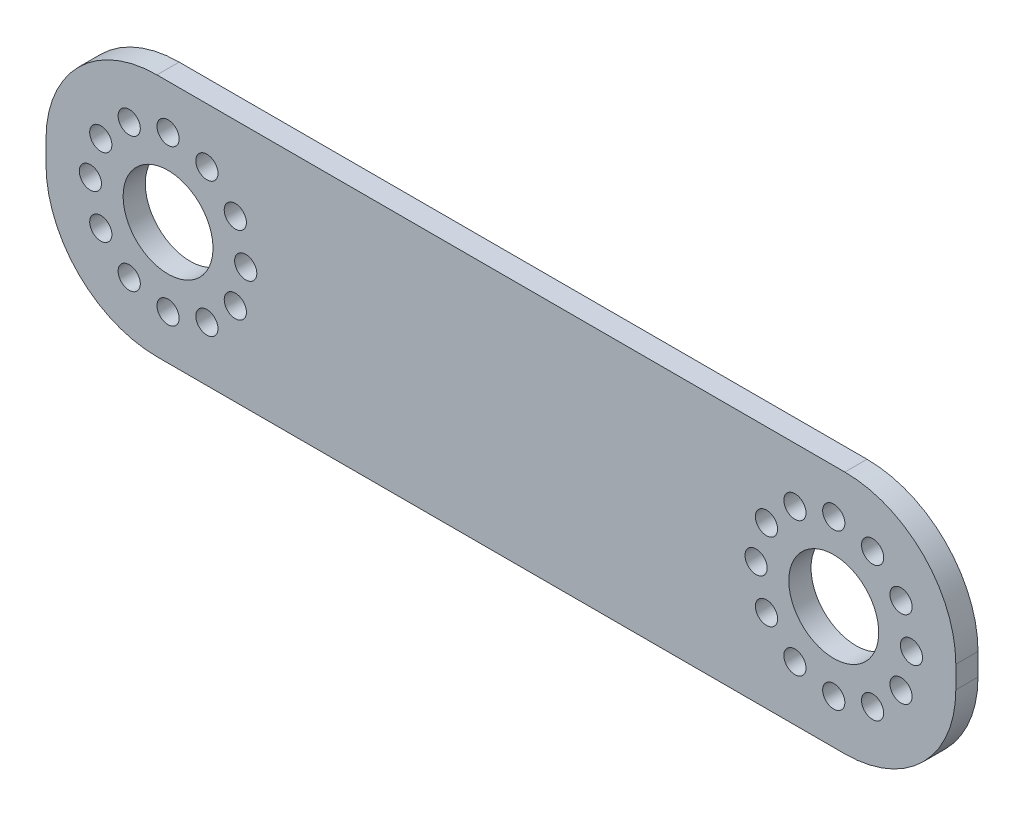
ISO-10303-21;
HEADER;
FILE_DESCRIPTION(('STEP AP214'),'2;1');
FILE_NAME('part.step','',(''),(''),'','','');
FILE_SCHEMA(('AUTOMOTIVE_DESIGN { 1 0 10303 214 1 1 1 1 }'));
ENDSEC;
DATA;
#1=APPLICATION_CONTEXT('core data for automotive mechanical design processes');
#2=APPLICATION_PROTOCOL_DEFINITION('international standard','automotive_design',2000,#1);
#3=PRODUCT_CONTEXT('',#1,'mechanical');
#4=PRODUCT('Part','Part','',(#3));
#5=PRODUCT_RELATED_PRODUCT_CATEGORY('part','',(#4));
#6=PRODUCT_DEFINITION_FORMATION('','',#4);
#7=PRODUCT_DEFINITION_CONTEXT('part definition',#1,'design');
#8=PRODUCT_DEFINITION('design','',#6,#7);
#9=PRODUCT_DEFINITION_SHAPE('','',#8);
#10=(LENGTH_UNIT() NAMED_UNIT(*) SI_UNIT(.MILLI.,.METRE.));
#11=(NAMED_UNIT(*) PLANE_ANGLE_UNIT() SI_UNIT($,.RADIAN.));
#12=(NAMED_UNIT(*) SI_UNIT($,.STERADIAN.) SOLID_ANGLE_UNIT());
#13=UNCERTAINTY_MEASURE_WITH_UNIT(LENGTH_MEASURE(1.E-05),#10,'distance_accuracy_value','');
#14=(GEOMETRIC_REPRESENTATION_CONTEXT(3) GLOBAL_UNCERTAINTY_ASSIGNED_CONTEXT((#13)) GLOBAL_UNIT_ASSIGNED_CONTEXT((#10,
#11,#12)) REPRESENTATION_CONTEXT('',''));
#15=CARTESIAN_POINT('',(0.,0.,0.));
#16=DIRECTION('',(0.,0.,1.));
#17=DIRECTION('',(1.,0.,0.));
#18=AXIS2_PLACEMENT_3D('',#15,#16,#17);
#19=CARTESIAN_POINT('',(82.,11.,2.));
#20=DIRECTION('',(1.,0.,0.));
#21=DIRECTION('',(0.,0.,-1.));
#22=AXIS2_PLACEMENT_3D('',#19,#20,#21);
#23=PLANE('',#22);
#24=DIRECTION('',(0.,-1.,0.));
#25=VECTOR('',#24,1.);
#26=CARTESIAN_POINT('',(82.,11.,0.));
#27=LINE('',#26,#25);
#28=CARTESIAN_POINT('',(82.,0.999999999999999,0.));
#29=VERTEX_POINT('',#28);
#30=CARTESIAN_POINT('',(82.,-0.999999999999999,0.));
#31=VERTEX_POINT('',#30);
#32=EDGE_CURVE('E184',#29,#31,#27,.T.);
#33=ORIENTED_EDGE('',*,*,#32,.F.);
#34=DIRECTION('',(0.,0.,-1.));
#35=VECTOR('',#34,1.);
#36=CARTESIAN_POINT('',(82.,0.999999999999999,2.));
#37=LINE('',#36,#35);
#38=CARTESIAN_POINT('',(82.,0.999999999999999,2.));
#39=VERTEX_POINT('',#38);
#40=EDGE_CURVE('E154',#29,#39,#37,.F.);
#41=ORIENTED_EDGE('',*,*,#40,.T.);
#42=DIRECTION('',(0.,-1.,0.));
#43=VECTOR('',#42,1.);
#44=CARTESIAN_POINT('',(82.,11.,2.));
#45=LINE('',#44,#43);
#46=CARTESIAN_POINT('',(82.,-0.999999999999999,2.));
#47=VERTEX_POINT('',#46);
#48=EDGE_CURVE('E128',#39,#47,#45,.T.);
#49=ORIENTED_EDGE('',*,*,#48,.T.);
#50=DIRECTION('',(0.,0.,-1.));
#51=VECTOR('',#50,1.);
#52=CARTESIAN_POINT('',(82.,-0.999999999999999,2.));
#53=LINE('',#52,#51);
#54=EDGE_CURVE('E150',#47,#31,#53,.T.);
#55=ORIENTED_EDGE('',*,*,#54,.T.);
#56=EDGE_LOOP('',(#33,#41,#49,#55));
#57=FACE_BOUND('',#56,.T.);
#58=ADVANCED_FACE('F39',(#57),#23,.T.);
#59=CARTESIAN_POINT('',(0.,11.,2.));
#60=DIRECTION('',(0.,1.,0.));
#61=DIRECTION('',(-1.,0.,0.));
#62=AXIS2_PLACEMENT_3D('',#59,#60,#61);
#63=PLANE('',#62);
#64=DIRECTION('',(1.,0.,0.));
#65=VECTOR('',#64,1.);
#66=CARTESIAN_POINT('',(0.,11.,2.));
#67=LINE('',#66,#65);
#68=CARTESIAN_POINT('',(10.,11.,2.));
#69=VERTEX_POINT('',#68);
#70=CARTESIAN_POINT('',(72.,11.,2.));
#71=VERTEX_POINT('',#70);
#72=EDGE_CURVE('E133',#69,#71,#67,.T.);
#73=ORIENTED_EDGE('',*,*,#72,.T.);
#74=DIRECTION('',(0.,0.,-1.));
#75=VECTOR('',#74,1.);
#76=CARTESIAN_POINT('',(72.,11.,2.));
#77=LINE('',#76,#75);
#78=CARTESIAN_POINT('',(72.,11.,0.));
#79=VERTEX_POINT('',#78);
#80=EDGE_CURVE('E118',#71,#79,#77,.T.);
#81=ORIENTED_EDGE('',*,*,#80,.T.);
#82=DIRECTION('',(1.,0.,0.));
#83=VECTOR('',#82,1.);
#84=CARTESIAN_POINT('',(0.,11.,0.));
#85=LINE('',#84,#83);
#86=CARTESIAN_POINT('',(10.,11.,0.));
#87=VERTEX_POINT('',#86);
#88=EDGE_CURVE('E109',#87,#79,#85,.T.);
#89=ORIENTED_EDGE('',*,*,#88,.F.);
#90=DIRECTION('',(0.,0.,-1.));
#91=VECTOR('',#90,1.);
#92=CARTESIAN_POINT('',(10.,11.,2.));
#93=LINE('',#92,#91);
#94=EDGE_CURVE('E124',#87,#69,#93,.F.);
#95=ORIENTED_EDGE('',*,*,#94,.T.);
#96=EDGE_LOOP('',(#73,#81,#89,#95));
#97=FACE_BOUND('',#96,.T.);
#98=ADVANCED_FACE('F123',(#97),#63,.T.);
#99=CARTESIAN_POINT('',(0.,-11.,2.));
#100=DIRECTION('',(-1.,0.,0.));
#101=DIRECTION('',(0.,-1.,0.));
#102=AXIS2_PLACEMENT_3D('',#99,#100,#101);
#103=PLANE('',#102);
#104=DIRECTION('',(0.,1.,0.));
#105=VECTOR('',#104,1.);
#106=CARTESIAN_POINT('',(0.,-11.,0.));
#107=LINE('',#106,#105);
#108=CARTESIAN_POINT('',(0.,-0.999999999999996,0.));
#109=VERTEX_POINT('',#108);
#110=CARTESIAN_POINT('',(0.,1.,0.));
#111=VERTEX_POINT('',#110);
#112=EDGE_CURVE('E111',#109,#111,#107,.T.);
#113=ORIENTED_EDGE('',*,*,#112,.F.);
#114=DIRECTION('',(0.,0.,-1.));
#115=VECTOR('',#114,1.);
#116=CARTESIAN_POINT('',(0.,-0.999999999999996,2.));
#117=LINE('',#116,#115);
#118=CARTESIAN_POINT('',(0.,-0.999999999999996,2.));
#119=VERTEX_POINT('',#118);
#120=EDGE_CURVE('E11',#109,#119,#117,.F.);
#121=ORIENTED_EDGE('',*,*,#120,.T.);
#122=DIRECTION('',(0.,1.,0.));
#123=VECTOR('',#122,1.);
#124=CARTESIAN_POINT('',(0.,-11.,2.));
#125=LINE('',#124,#123);
#126=CARTESIAN_POINT('',(0.,1.,2.));
#127=VERTEX_POINT('',#126);
#128=EDGE_CURVE('E138',#119,#127,#125,.T.);
#129=ORIENTED_EDGE('',*,*,#128,.T.);
#130=DIRECTION('',(0.,0.,-1.));
#131=VECTOR('',#130,1.);
#132=CARTESIAN_POINT('',(0.,1.,2.));
#133=LINE('',#132,#131);
#134=EDGE_CURVE('E48',#127,#111,#133,.T.);
#135=ORIENTED_EDGE('',*,*,#134,.T.);
#136=EDGE_LOOP('',(#113,#121,#129,#135));
#137=FACE_BOUND('',#136,.T.);
#138=ADVANCED_FACE('F175',(#137),#103,.T.);
#139=CARTESIAN_POINT('',(82.,-11.,2.));
#140=DIRECTION('',(0.,-1.,0.));
#141=DIRECTION('',(1.,0.,0.));
#142=AXIS2_PLACEMENT_3D('',#139,#140,#141);
#143=PLANE('',#142);
#144=DIRECTION('',(-1.,0.,0.));
#145=VECTOR('',#144,1.);
#146=CARTESIAN_POINT('',(82.,-11.,0.));
#147=LINE('',#146,#145);
#148=CARTESIAN_POINT('',(72.,-11.,0.));
#149=VERTEX_POINT('',#148);
#150=CARTESIAN_POINT('',(9.99999999999999,-11.,0.));
#151=VERTEX_POINT('',#150);
#152=EDGE_CURVE('E188',#149,#151,#147,.T.);
#153=ORIENTED_EDGE('',*,*,#152,.F.);
#154=DIRECTION('',(0.,0.,-1.));
#155=VECTOR('',#154,1.);
#156=CARTESIAN_POINT('',(72.,-11.,2.));
#157=LINE('',#156,#155);
#158=CARTESIAN_POINT('',(72.,-11.,2.));
#159=VERTEX_POINT('',#158);
#160=EDGE_CURVE('E62',#149,#159,#157,.F.);
#161=ORIENTED_EDGE('',*,*,#160,.T.);
#162=DIRECTION('',(-1.,0.,0.));
#163=VECTOR('',#162,1.);
#164=CARTESIAN_POINT('',(82.,-11.,2.));
#165=LINE('',#164,#163);
#166=CARTESIAN_POINT('',(9.99999999999999,-11.,2.));
#167=VERTEX_POINT('',#166);
#168=EDGE_CURVE('E178',#159,#167,#165,.T.);
#169=ORIENTED_EDGE('',*,*,#168,.T.);
#170=DIRECTION('',(0.,0.,-1.));
#171=VECTOR('',#170,1.);
#172=CARTESIAN_POINT('',(9.99999999999999,-11.,2.));
#173=LINE('',#172,#171);
#174=EDGE_CURVE('E167',#167,#151,#173,.T.);
#175=ORIENTED_EDGE('',*,*,#174,.T.);
#176=EDGE_LOOP('',(#153,#161,#169,#175));
#177=FACE_BOUND('',#176,.T.);
#178=ADVANCED_FACE('F413',(#177),#143,.T.);
#179=CARTESIAN_POINT('',(0.,0.,2.));
#180=DIRECTION('',(0.,0.,-1.));
#181=DIRECTION('',(-1.,0.,0.));
#182=AXIS2_PLACEMENT_3D('',#179,#180,#181);
#183=PLANE('',#182);
#184=CARTESIAN_POINT('',(64.9378221735089,3.5,2.));
#185=DIRECTION('',(0.,0.,-1.));
#186=DIRECTION('',(-1.,0.,0.));
#187=AXIS2_PLACEMENT_3D('',#184,#185,#186);
#188=CIRCLE('',#187,0.999999999999998);
#189=CARTESIAN_POINT('',(63.9378221735089,3.5,2.));
#190=VERTEX_POINT('',#189);
#191=EDGE_CURVE('E393',#190,#190,#188,.T.);
#192=ORIENTED_EDGE('',*,*,#191,.T.);
#193=EDGE_LOOP('',(#192));
#194=FACE_BOUND('',#193,.T.);
#195=CARTESIAN_POINT('',(67.5,6.06217782649107,2.));
#196=DIRECTION('',(0.,0.,-1.));
#197=DIRECTION('',(-1.,0.,0.));
#198=AXIS2_PLACEMENT_3D('',#195,#196,#197);
#199=CIRCLE('',#198,1.00000000000001);
#200=CARTESIAN_POINT('',(66.5,6.06217782649107,2.));
#201=VERTEX_POINT('',#200);
#202=EDGE_CURVE('E385',#201,#201,#199,.T.);
#203=ORIENTED_EDGE('',*,*,#202,.T.);
#204=EDGE_LOOP('',(#203));
#205=FACE_BOUND('',#204,.T.);
#206=CARTESIAN_POINT('',(71.,7.,2.));
#207=DIRECTION('',(0.,0.,-1.));
#208=DIRECTION('',(-1.,0.,0.));
#209=AXIS2_PLACEMENT_3D('',#206,#207,#208);
#210=CIRCLE('',#209,0.999999999999998);
#211=CARTESIAN_POINT('',(70.,7.,2.));
#212=VERTEX_POINT('',#211);
#213=EDGE_CURVE('E377',#212,#212,#210,.T.);
#214=ORIENTED_EDGE('',*,*,#213,.T.);
#215=EDGE_LOOP('',(#214));
#216=FACE_BOUND('',#215,.T.);
#217=CARTESIAN_POINT('',(74.5,6.06217782649107,2.));
#218=DIRECTION('',(0.,0.,-1.));
#219=DIRECTION('',(-1.,0.,0.));
#220=AXIS2_PLACEMENT_3D('',#217,#218,#219);
#221=CIRCLE('',#220,0.999999999999998);
#222=CARTESIAN_POINT('',(73.5,6.06217782649107,2.));
#223=VERTEX_POINT('',#222);
#224=EDGE_CURVE('E369',#223,#223,#221,.T.);
#225=ORIENTED_EDGE('',*,*,#224,.T.);
#226=EDGE_LOOP('',(#225));
#227=FACE_BOUND('',#226,.T.);
#228=CARTESIAN_POINT('',(77.0621778264911,3.5,2.));
#229=DIRECTION('',(0.,0.,-1.));
#230=DIRECTION('',(-1.,0.,0.));
#231=AXIS2_PLACEMENT_3D('',#228,#229,#230);
#232=CIRCLE('',#231,0.999999999999998);
#233=CARTESIAN_POINT('',(76.0621778264911,3.5,2.));
#234=VERTEX_POINT('',#233);
#235=EDGE_CURVE('E361',#234,#234,#232,.T.);
#236=ORIENTED_EDGE('',*,*,#235,.T.);
#237=EDGE_LOOP('',(#236));
#238=FACE_BOUND('',#237,.T.);
#239=CARTESIAN_POINT('',(78.,0.,2.));
#240=DIRECTION('',(0.,0.,-1.));
#241=DIRECTION('',(-1.,0.,0.));
#242=AXIS2_PLACEMENT_3D('',#239,#240,#241);
#243=CIRCLE('',#242,1.00000000000001);
#244=CARTESIAN_POINT('',(77.,0.,2.));
#245=VERTEX_POINT('',#244);
#246=EDGE_CURVE('E353',#245,#245,#243,.T.);
#247=ORIENTED_EDGE('',*,*,#246,.T.);
#248=EDGE_LOOP('',(#247));
#249=FACE_BOUND('',#248,.T.);
#250=CARTESIAN_POINT('',(77.0621778264911,-3.5,2.));
#251=DIRECTION('',(0.,0.,-1.));
#252=DIRECTION('',(-1.,0.,0.));
#253=AXIS2_PLACEMENT_3D('',#250,#251,#252);
#254=CIRCLE('',#253,0.999999999999998);
#255=CARTESIAN_POINT('',(76.0621778264911,-3.5,2.));
#256=VERTEX_POINT('',#255);
#257=EDGE_CURVE('E345',#256,#256,#254,.T.);
#258=ORIENTED_EDGE('',*,*,#257,.T.);
#259=EDGE_LOOP('',(#258));
#260=FACE_BOUND('',#259,.T.);
#261=CARTESIAN_POINT('',(74.5,-6.06217782649107,2.));
#262=DIRECTION('',(0.,0.,-1.));
#263=DIRECTION('',(-1.,0.,0.));
#264=AXIS2_PLACEMENT_3D('',#261,#262,#263);
#265=CIRCLE('',#264,1.00000000000001);
#266=CARTESIAN_POINT('',(73.5,-6.06217782649107,2.));
#267=VERTEX_POINT('',#266);
#268=EDGE_CURVE('E337',#267,#267,#265,.T.);
#269=ORIENTED_EDGE('',*,*,#268,.T.);
#270=EDGE_LOOP('',(#269));
#271=FACE_BOUND('',#270,.T.);
#272=CARTESIAN_POINT('',(71.,-7.,2.));
#273=DIRECTION('',(0.,0.,-1.));
#274=DIRECTION('',(-1.,0.,0.));
#275=AXIS2_PLACEMENT_3D('',#272,#273,#274);
#276=CIRCLE('',#275,0.999999999999998);
#277=CARTESIAN_POINT('',(70.,-7.,2.));
#278=VERTEX_POINT('',#277);
#279=EDGE_CURVE('E329',#278,#278,#276,.T.);
#280=ORIENTED_EDGE('',*,*,#279,.T.);
#281=EDGE_LOOP('',(#280));
#282=FACE_BOUND('',#281,.T.);
#283=CARTESIAN_POINT('',(67.5,-6.06217782649107,2.));
#284=DIRECTION('',(0.,0.,-1.));
#285=DIRECTION('',(-1.,0.,0.));
#286=AXIS2_PLACEMENT_3D('',#283,#284,#285);
#287=CIRCLE('',#286,0.999999999999998);
#288=CARTESIAN_POINT('',(66.5,-6.06217782649107,2.));
#289=VERTEX_POINT('',#288);
#290=EDGE_CURVE('E321',#289,#289,#287,.T.);
#291=ORIENTED_EDGE('',*,*,#290,.T.);
#292=EDGE_LOOP('',(#291));
#293=FACE_BOUND('',#292,.T.);
#294=CARTESIAN_POINT('',(64.9378221735089,-3.5,2.));
#295=DIRECTION('',(0.,0.,-1.));
#296=DIRECTION('',(-1.,0.,0.));
#297=AXIS2_PLACEMENT_3D('',#294,#295,#296);
#298=CIRCLE('',#297,0.999999999999998);
#299=CARTESIAN_POINT('',(63.9378221735089,-3.5,2.));
#300=VERTEX_POINT('',#299);
#301=EDGE_CURVE('E313',#300,#300,#298,.T.);
#302=ORIENTED_EDGE('',*,*,#301,.T.);
#303=EDGE_LOOP('',(#302));
#304=FACE_BOUND('',#303,.T.);
#305=CARTESIAN_POINT('',(64.,0.,2.));
#306=DIRECTION('',(0.,0.,-1.));
#307=DIRECTION('',(-1.,0.,0.));
#308=AXIS2_PLACEMENT_3D('',#305,#306,#307);
#309=CIRCLE('',#308,0.999999999999998);
#310=CARTESIAN_POINT('',(63.,0.,2.));
#311=VERTEX_POINT('',#310);
#312=EDGE_CURVE('E305',#311,#311,#309,.T.);
#313=ORIENTED_EDGE('',*,*,#312,.T.);
#314=EDGE_LOOP('',(#313));
#315=FACE_BOUND('',#314,.T.);
#316=CARTESIAN_POINT('',(71.,0.,2.));
#317=DIRECTION('',(0.,0.,-1.));
#318=DIRECTION('',(-1.,0.,0.));
#319=AXIS2_PLACEMENT_3D('',#316,#317,#318);
#320=CIRCLE('',#319,4.05);
#321=CARTESIAN_POINT('',(66.95,0.,2.));
#322=VERTEX_POINT('',#321);
#323=EDGE_CURVE('E297',#322,#322,#320,.T.);
#324=ORIENTED_EDGE('',*,*,#323,.T.);
#325=EDGE_LOOP('',(#324));
#326=FACE_BOUND('',#325,.T.);
#327=CARTESIAN_POINT('',(4.93782217350893,3.5,2.));
#328=DIRECTION('',(0.,0.,-1.));
#329=DIRECTION('',(-1.,0.,0.));
#330=AXIS2_PLACEMENT_3D('',#327,#328,#329);
#331=CIRCLE('',#330,1.);
#332=CARTESIAN_POINT('',(3.93782217350893,3.5,2.));
#333=VERTEX_POINT('',#332);
#334=EDGE_CURVE('E289',#333,#333,#331,.T.);
#335=ORIENTED_EDGE('',*,*,#334,.T.);
#336=EDGE_LOOP('',(#335));
#337=FACE_BOUND('',#336,.T.);
#338=CARTESIAN_POINT('',(7.5,6.06217782649107,2.));
#339=DIRECTION('',(0.,0.,-1.));
#340=DIRECTION('',(-1.,0.,0.));
#341=AXIS2_PLACEMENT_3D('',#338,#339,#340);
#342=CIRCLE('',#341,1.);
#343=CARTESIAN_POINT('',(6.5,6.06217782649107,2.));
#344=VERTEX_POINT('',#343);
#345=EDGE_CURVE('E281',#344,#344,#342,.T.);
#346=ORIENTED_EDGE('',*,*,#345,.T.);
#347=EDGE_LOOP('',(#346));
#348=FACE_BOUND('',#347,.T.);
#349=CARTESIAN_POINT('',(11.,7.,2.));
#350=DIRECTION('',(0.,0.,-1.));
#351=DIRECTION('',(-1.,0.,0.));
#352=AXIS2_PLACEMENT_3D('',#349,#350,#351);
#353=CIRCLE('',#352,1.);
#354=CARTESIAN_POINT('',(10.,7.,2.));
#355=VERTEX_POINT('',#354);
#356=EDGE_CURVE('E273',#355,#355,#353,.T.);
#357=ORIENTED_EDGE('',*,*,#356,.T.);
#358=EDGE_LOOP('',(#357));
#359=FACE_BOUND('',#358,.T.);
#360=CARTESIAN_POINT('',(14.5,6.06217782649107,2.));
#361=DIRECTION('',(0.,0.,-1.));
#362=DIRECTION('',(-1.,0.,0.));
#363=AXIS2_PLACEMENT_3D('',#360,#361,#362);
#364=CIRCLE('',#363,1.);
#365=CARTESIAN_POINT('',(13.5,6.06217782649107,2.));
#366=VERTEX_POINT('',#365);
#367=EDGE_CURVE('E265',#366,#366,#364,.T.);
#368=ORIENTED_EDGE('',*,*,#367,.T.);
#369=EDGE_LOOP('',(#368));
#370=FACE_BOUND('',#369,.T.);
#371=CARTESIAN_POINT('',(17.0621778264911,3.5,2.));
#372=DIRECTION('',(0.,0.,-1.));
#373=DIRECTION('',(-1.,0.,0.));
#374=AXIS2_PLACEMENT_3D('',#371,#372,#373);
#375=CIRCLE('',#374,1.);
#376=CARTESIAN_POINT('',(16.0621778264911,3.5,2.));
#377=VERTEX_POINT('',#376);
#378=EDGE_CURVE('E257',#377,#377,#375,.T.);
#379=ORIENTED_EDGE('',*,*,#378,.T.);
#380=EDGE_LOOP('',(#379));
#381=FACE_BOUND('',#380,.T.);
#382=CARTESIAN_POINT('',(18.,0.,2.));
#383=DIRECTION('',(0.,0.,-1.));
#384=DIRECTION('',(-1.,0.,0.));
#385=AXIS2_PLACEMENT_3D('',#382,#383,#384);
#386=CIRCLE('',#385,0.999999999999998);
#387=CARTESIAN_POINT('',(17.,0.,2.));
#388=VERTEX_POINT('',#387);
#389=EDGE_CURVE('E249',#388,#388,#386,.T.);
#390=ORIENTED_EDGE('',*,*,#389,.T.);
#391=EDGE_LOOP('',(#390));
#392=FACE_BOUND('',#391,.T.);
#393=CARTESIAN_POINT('',(17.0621778264911,-3.5,2.));
#394=DIRECTION('',(0.,0.,-1.));
#395=DIRECTION('',(-1.,0.,0.));
#396=AXIS2_PLACEMENT_3D('',#393,#394,#395);
#397=CIRCLE('',#396,0.999999999999998);
#398=CARTESIAN_POINT('',(16.0621778264911,-3.5,2.));
#399=VERTEX_POINT('',#398);
#400=EDGE_CURVE('E241',#399,#399,#397,.T.);
#401=ORIENTED_EDGE('',*,*,#400,.T.);
#402=EDGE_LOOP('',(#401));
#403=FACE_BOUND('',#402,.T.);
#404=CARTESIAN_POINT('',(14.5,-6.06217782649107,2.));
#405=DIRECTION('',(0.,0.,-1.));
#406=DIRECTION('',(-1.,0.,0.));
#407=AXIS2_PLACEMENT_3D('',#404,#405,#406);
#408=CIRCLE('',#407,1.);
#409=CARTESIAN_POINT('',(13.5,-6.06217782649107,2.));
#410=VERTEX_POINT('',#409);
#411=EDGE_CURVE('E233',#410,#410,#408,.T.);
#412=ORIENTED_EDGE('',*,*,#411,.T.);
#413=EDGE_LOOP('',(#412));
#414=FACE_BOUND('',#413,.T.);
#415=CARTESIAN_POINT('',(11.,-7.,2.));
#416=DIRECTION('',(0.,0.,-1.));
#417=DIRECTION('',(-1.,0.,0.));
#418=AXIS2_PLACEMENT_3D('',#415,#416,#417);
#419=CIRCLE('',#418,1.);
#420=CARTESIAN_POINT('',(10.,-7.,2.));
#421=VERTEX_POINT('',#420);
#422=EDGE_CURVE('E225',#421,#421,#419,.T.);
#423=ORIENTED_EDGE('',*,*,#422,.T.);
#424=EDGE_LOOP('',(#423));
#425=FACE_BOUND('',#424,.T.);
#426=CARTESIAN_POINT('',(7.5,-6.06217782649107,2.));
#427=DIRECTION('',(0.,0.,-1.));
#428=DIRECTION('',(-1.,0.,0.));
#429=AXIS2_PLACEMENT_3D('',#426,#427,#428);
#430=CIRCLE('',#429,1.);
#431=CARTESIAN_POINT('',(6.5,-6.06217782649107,2.));
#432=VERTEX_POINT('',#431);
#433=EDGE_CURVE('E217',#432,#432,#430,.T.);
#434=ORIENTED_EDGE('',*,*,#433,.T.);
#435=EDGE_LOOP('',(#434));
#436=FACE_BOUND('',#435,.T.);
#437=CARTESIAN_POINT('',(4.93782217350893,-3.5,2.));
#438=DIRECTION('',(0.,0.,-1.));
#439=DIRECTION('',(-1.,0.,0.));
#440=AXIS2_PLACEMENT_3D('',#437,#438,#439);
#441=CIRCLE('',#440,1.);
#442=CARTESIAN_POINT('',(3.93782217350893,-3.5,2.));
#443=VERTEX_POINT('',#442);
#444=EDGE_CURVE('E209',#443,#443,#441,.T.);
#445=ORIENTED_EDGE('',*,*,#444,.T.);
#446=EDGE_LOOP('',(#445));
#447=FACE_BOUND('',#446,.T.);
#448=CARTESIAN_POINT('',(4.,0.,2.));
#449=DIRECTION('',(0.,0.,-1.));
#450=DIRECTION('',(-1.,0.,0.));
#451=AXIS2_PLACEMENT_3D('',#448,#449,#450);
#452=CIRCLE('',#451,1.);
#453=CARTESIAN_POINT('',(3.,0.,2.));
#454=VERTEX_POINT('',#453);
#455=EDGE_CURVE('E201',#454,#454,#452,.T.);
#456=ORIENTED_EDGE('',*,*,#455,.T.);
#457=EDGE_LOOP('',(#456));
#458=FACE_BOUND('',#457,.T.);
#459=CARTESIAN_POINT('',(11.,0.,2.));
#460=DIRECTION('',(0.,0.,-1.));
#461=DIRECTION('',(-1.,0.,0.));
#462=AXIS2_PLACEMENT_3D('',#459,#460,#461);
#463=CIRCLE('',#462,4.05);
#464=CARTESIAN_POINT('',(6.95,0.,2.));
#465=VERTEX_POINT('',#464);
#466=EDGE_CURVE('E189',#465,#465,#463,.T.);
#467=ORIENTED_EDGE('',*,*,#466,.T.);
#468=EDGE_LOOP('',(#467));
#469=FACE_BOUND('',#468,.T.);
#470=ORIENTED_EDGE('',*,*,#48,.F.);
#471=CARTESIAN_POINT('',(72.,0.999999999999999,2.));
#472=DIRECTION('',(0.,0.,-1.));
#473=DIRECTION('',(-1.,0.,0.));
#474=AXIS2_PLACEMENT_3D('',#471,#472,#473);
#475=CIRCLE('',#474,10.);
#476=EDGE_CURVE('E164',#39,#71,#475,.F.);
#477=ORIENTED_EDGE('',*,*,#476,.T.);
#478=ORIENTED_EDGE('',*,*,#72,.F.);
#479=CARTESIAN_POINT('',(10.,1.,2.));
#480=DIRECTION('',(0.,0.,-1.));
#481=DIRECTION('',(-1.,0.,0.));
#482=AXIS2_PLACEMENT_3D('',#479,#480,#481);
#483=CIRCLE('',#482,10.);
#484=EDGE_CURVE('E131',#69,#127,#483,.F.);
#485=ORIENTED_EDGE('',*,*,#484,.T.);
#486=ORIENTED_EDGE('',*,*,#128,.F.);
#487=CARTESIAN_POINT('',(9.99999999999999,-0.999999999999998,2.));
#488=DIRECTION('',(0.,0.,-1.));
#489=DIRECTION('',(-1.,0.,0.));
#490=AXIS2_PLACEMENT_3D('',#487,#488,#489);
#491=CIRCLE('',#490,10.);
#492=EDGE_CURVE('E55',#119,#167,#491,.F.);
#493=ORIENTED_EDGE('',*,*,#492,.T.);
#494=ORIENTED_EDGE('',*,*,#168,.F.);
#495=CARTESIAN_POINT('',(72.,-0.999999999999999,2.));
#496=DIRECTION('',(0.,0.,-1.));
#497=DIRECTION('',(-1.,0.,0.));
#498=AXIS2_PLACEMENT_3D('',#495,#496,#497);
#499=CIRCLE('',#498,10.);
#500=EDGE_CURVE('E161',#159,#47,#499,.F.);
#501=ORIENTED_EDGE('',*,*,#500,.T.);
#502=EDGE_LOOP('',(#470,#477,#478,#485,#486,#493,#494,#501));
#503=FACE_BOUND('',#502,.T.);
#504=ADVANCED_FACE('F442',(#194,#205,#216,#227,#238,#249,#260,#271,#282,#293,#304,#315,#326,
#337,#348,#359,#370,#381,#392,#403,#414,#425,#436,#447,#458,#469,#503),#183,.F.);
#505=CARTESIAN_POINT('',(0.,0.,0.));
#506=DIRECTION('',(0.,0.,-1.));
#507=DIRECTION('',(-1.,0.,0.));
#508=AXIS2_PLACEMENT_3D('',#505,#506,#507);
#509=PLANE('',#508);
#510=CARTESIAN_POINT('',(64.9378221735089,3.5,0.));
#511=DIRECTION('',(0.,0.,-1.));
#512=DIRECTION('',(-1.,0.,0.));
#513=AXIS2_PLACEMENT_3D('',#510,#511,#512);
#514=CIRCLE('',#513,0.999999999999998);
#515=CARTESIAN_POINT('',(63.9378221735089,3.5,0.));
#516=VERTEX_POINT('',#515);
#517=EDGE_CURVE('E397',#516,#516,#514,.T.);
#518=ORIENTED_EDGE('',*,*,#517,.F.);
#519=EDGE_LOOP('',(#518));
#520=FACE_BOUND('',#519,.T.);
#521=CARTESIAN_POINT('',(67.5,6.06217782649107,0.));
#522=DIRECTION('',(0.,0.,-1.));
#523=DIRECTION('',(-1.,0.,0.));
#524=AXIS2_PLACEMENT_3D('',#521,#522,#523);
#525=CIRCLE('',#524,1.00000000000001);
#526=CARTESIAN_POINT('',(66.5,6.06217782649107,0.));
#527=VERTEX_POINT('',#526);
#528=EDGE_CURVE('E389',#527,#527,#525,.T.);
#529=ORIENTED_EDGE('',*,*,#528,.F.);
#530=EDGE_LOOP('',(#529));
#531=FACE_BOUND('',#530,.T.);
#532=CARTESIAN_POINT('',(71.,7.,0.));
#533=DIRECTION('',(0.,0.,-1.));
#534=DIRECTION('',(-1.,0.,0.));
#535=AXIS2_PLACEMENT_3D('',#532,#533,#534);
#536=CIRCLE('',#535,0.999999999999998);
#537=CARTESIAN_POINT('',(70.,7.,0.));
#538=VERTEX_POINT('',#537);
#539=EDGE_CURVE('E381',#538,#538,#536,.T.);
#540=ORIENTED_EDGE('',*,*,#539,.F.);
#541=EDGE_LOOP('',(#540));
#542=FACE_BOUND('',#541,.T.);
#543=CARTESIAN_POINT('',(74.5,6.06217782649107,0.));
#544=DIRECTION('',(0.,0.,-1.));
#545=DIRECTION('',(-1.,0.,0.));
#546=AXIS2_PLACEMENT_3D('',#543,#544,#545);
#547=CIRCLE('',#546,0.999999999999998);
#548=CARTESIAN_POINT('',(73.5,6.06217782649107,0.));
#549=VERTEX_POINT('',#548);
#550=EDGE_CURVE('E373',#549,#549,#547,.T.);
#551=ORIENTED_EDGE('',*,*,#550,.F.);
#552=EDGE_LOOP('',(#551));
#553=FACE_BOUND('',#552,.T.);
#554=CARTESIAN_POINT('',(77.0621778264911,3.5,0.));
#555=DIRECTION('',(0.,0.,-1.));
#556=DIRECTION('',(-1.,0.,0.));
#557=AXIS2_PLACEMENT_3D('',#554,#555,#556);
#558=CIRCLE('',#557,0.999999999999998);
#559=CARTESIAN_POINT('',(76.0621778264911,3.5,0.));
#560=VERTEX_POINT('',#559);
#561=EDGE_CURVE('E365',#560,#560,#558,.T.);
#562=ORIENTED_EDGE('',*,*,#561,.F.);
#563=EDGE_LOOP('',(#562));
#564=FACE_BOUND('',#563,.T.);
#565=CARTESIAN_POINT('',(78.,0.,0.));
#566=DIRECTION('',(0.,0.,-1.));
#567=DIRECTION('',(-1.,0.,0.));
#568=AXIS2_PLACEMENT_3D('',#565,#566,#567);
#569=CIRCLE('',#568,1.00000000000001);
#570=CARTESIAN_POINT('',(77.,0.,0.));
#571=VERTEX_POINT('',#570);
#572=EDGE_CURVE('E357',#571,#571,#569,.T.);
#573=ORIENTED_EDGE('',*,*,#572,.F.);
#574=EDGE_LOOP('',(#573));
#575=FACE_BOUND('',#574,.T.);
#576=CARTESIAN_POINT('',(77.0621778264911,-3.5,0.));
#577=DIRECTION('',(0.,0.,-1.));
#578=DIRECTION('',(-1.,0.,0.));
#579=AXIS2_PLACEMENT_3D('',#576,#577,#578);
#580=CIRCLE('',#579,0.999999999999998);
#581=CARTESIAN_POINT('',(76.0621778264911,-3.5,0.));
#582=VERTEX_POINT('',#581);
#583=EDGE_CURVE('E349',#582,#582,#580,.T.);
#584=ORIENTED_EDGE('',*,*,#583,.F.);
#585=EDGE_LOOP('',(#584));
#586=FACE_BOUND('',#585,.T.);
#587=CARTESIAN_POINT('',(74.5,-6.06217782649107,0.));
#588=DIRECTION('',(0.,0.,-1.));
#589=DIRECTION('',(-1.,0.,0.));
#590=AXIS2_PLACEMENT_3D('',#587,#588,#589);
#591=CIRCLE('',#590,1.00000000000001);
#592=CARTESIAN_POINT('',(73.5,-6.06217782649107,0.));
#593=VERTEX_POINT('',#592);
#594=EDGE_CURVE('E341',#593,#593,#591,.T.);
#595=ORIENTED_EDGE('',*,*,#594,.F.);
#596=EDGE_LOOP('',(#595));
#597=FACE_BOUND('',#596,.T.);
#598=CARTESIAN_POINT('',(71.,-7.,0.));
#599=DIRECTION('',(0.,0.,-1.));
#600=DIRECTION('',(-1.,0.,0.));
#601=AXIS2_PLACEMENT_3D('',#598,#599,#600);
#602=CIRCLE('',#601,0.999999999999998);
#603=CARTESIAN_POINT('',(70.,-7.,0.));
#604=VERTEX_POINT('',#603);
#605=EDGE_CURVE('E333',#604,#604,#602,.T.);
#606=ORIENTED_EDGE('',*,*,#605,.F.);
#607=EDGE_LOOP('',(#606));
#608=FACE_BOUND('',#607,.T.);
#609=CARTESIAN_POINT('',(67.5,-6.06217782649107,0.));
#610=DIRECTION('',(0.,0.,-1.));
#611=DIRECTION('',(-1.,0.,0.));
#612=AXIS2_PLACEMENT_3D('',#609,#610,#611);
#613=CIRCLE('',#612,0.999999999999998);
#614=CARTESIAN_POINT('',(66.5,-6.06217782649107,0.));
#615=VERTEX_POINT('',#614);
#616=EDGE_CURVE('E325',#615,#615,#613,.T.);
#617=ORIENTED_EDGE('',*,*,#616,.F.);
#618=EDGE_LOOP('',(#617));
#619=FACE_BOUND('',#618,.T.);
#620=CARTESIAN_POINT('',(64.9378221735089,-3.5,0.));
#621=DIRECTION('',(0.,0.,-1.));
#622=DIRECTION('',(-1.,0.,0.));
#623=AXIS2_PLACEMENT_3D('',#620,#621,#622);
#624=CIRCLE('',#623,0.999999999999998);
#625=CARTESIAN_POINT('',(63.9378221735089,-3.5,0.));
#626=VERTEX_POINT('',#625);
#627=EDGE_CURVE('E317',#626,#626,#624,.T.);
#628=ORIENTED_EDGE('',*,*,#627,.F.);
#629=EDGE_LOOP('',(#628));
#630=FACE_BOUND('',#629,.T.);
#631=CARTESIAN_POINT('',(64.,0.,0.));
#632=DIRECTION('',(0.,0.,-1.));
#633=DIRECTION('',(-1.,0.,0.));
#634=AXIS2_PLACEMENT_3D('',#631,#632,#633);
#635=CIRCLE('',#634,0.999999999999998);
#636=CARTESIAN_POINT('',(63.,0.,0.));
#637=VERTEX_POINT('',#636);
#638=EDGE_CURVE('E309',#637,#637,#635,.T.);
#639=ORIENTED_EDGE('',*,*,#638,.F.);
#640=EDGE_LOOP('',(#639));
#641=FACE_BOUND('',#640,.T.);
#642=CARTESIAN_POINT('',(71.,0.,0.));
#643=DIRECTION('',(0.,0.,-1.));
#644=DIRECTION('',(-1.,0.,0.));
#645=AXIS2_PLACEMENT_3D('',#642,#643,#644);
#646=CIRCLE('',#645,4.05);
#647=CARTESIAN_POINT('',(66.95,0.,0.));
#648=VERTEX_POINT('',#647);
#649=EDGE_CURVE('E301',#648,#648,#646,.T.);
#650=ORIENTED_EDGE('',*,*,#649,.F.);
#651=EDGE_LOOP('',(#650));
#652=FACE_BOUND('',#651,.T.);
#653=CARTESIAN_POINT('',(4.93782217350893,3.5,0.));
#654=DIRECTION('',(0.,0.,-1.));
#655=DIRECTION('',(-1.,0.,0.));
#656=AXIS2_PLACEMENT_3D('',#653,#654,#655);
#657=CIRCLE('',#656,1.);
#658=CARTESIAN_POINT('',(3.93782217350893,3.5,0.));
#659=VERTEX_POINT('',#658);
#660=EDGE_CURVE('E293',#659,#659,#657,.T.);
#661=ORIENTED_EDGE('',*,*,#660,.F.);
#662=EDGE_LOOP('',(#661));
#663=FACE_BOUND('',#662,.T.);
#664=CARTESIAN_POINT('',(7.5,6.06217782649107,0.));
#665=DIRECTION('',(0.,0.,-1.));
#666=DIRECTION('',(-1.,0.,0.));
#667=AXIS2_PLACEMENT_3D('',#664,#665,#666);
#668=CIRCLE('',#667,1.);
#669=CARTESIAN_POINT('',(6.5,6.06217782649107,0.));
#670=VERTEX_POINT('',#669);
#671=EDGE_CURVE('E285',#670,#670,#668,.T.);
#672=ORIENTED_EDGE('',*,*,#671,.F.);
#673=EDGE_LOOP('',(#672));
#674=FACE_BOUND('',#673,.T.);
#675=CARTESIAN_POINT('',(11.,7.,0.));
#676=DIRECTION('',(0.,0.,-1.));
#677=DIRECTION('',(-1.,0.,0.));
#678=AXIS2_PLACEMENT_3D('',#675,#676,#677);
#679=CIRCLE('',#678,1.);
#680=CARTESIAN_POINT('',(10.,7.,0.));
#681=VERTEX_POINT('',#680);
#682=EDGE_CURVE('E277',#681,#681,#679,.T.);
#683=ORIENTED_EDGE('',*,*,#682,.F.);
#684=EDGE_LOOP('',(#683));
#685=FACE_BOUND('',#684,.T.);
#686=CARTESIAN_POINT('',(14.5,6.06217782649107,0.));
#687=DIRECTION('',(0.,0.,-1.));
#688=DIRECTION('',(-1.,0.,0.));
#689=AXIS2_PLACEMENT_3D('',#686,#687,#688);
#690=CIRCLE('',#689,1.);
#691=CARTESIAN_POINT('',(13.5,6.06217782649107,0.));
#692=VERTEX_POINT('',#691);
#693=EDGE_CURVE('E269',#692,#692,#690,.T.);
#694=ORIENTED_EDGE('',*,*,#693,.F.);
#695=EDGE_LOOP('',(#694));
#696=FACE_BOUND('',#695,.T.);
#697=CARTESIAN_POINT('',(17.0621778264911,3.5,0.));
#698=DIRECTION('',(0.,0.,-1.));
#699=DIRECTION('',(-1.,0.,0.));
#700=AXIS2_PLACEMENT_3D('',#697,#698,#699);
#701=CIRCLE('',#700,1.);
#702=CARTESIAN_POINT('',(16.0621778264911,3.5,0.));
#703=VERTEX_POINT('',#702);
#704=EDGE_CURVE('E261',#703,#703,#701,.T.);
#705=ORIENTED_EDGE('',*,*,#704,.F.);
#706=EDGE_LOOP('',(#705));
#707=FACE_BOUND('',#706,.T.);
#708=CARTESIAN_POINT('',(18.,0.,0.));
#709=DIRECTION('',(0.,0.,-1.));
#710=DIRECTION('',(-1.,0.,0.));
#711=AXIS2_PLACEMENT_3D('',#708,#709,#710);
#712=CIRCLE('',#711,0.999999999999998);
#713=CARTESIAN_POINT('',(17.,0.,0.));
#714=VERTEX_POINT('',#713);
#715=EDGE_CURVE('E253',#714,#714,#712,.T.);
#716=ORIENTED_EDGE('',*,*,#715,.F.);
#717=EDGE_LOOP('',(#716));
#718=FACE_BOUND('',#717,.T.);
#719=CARTESIAN_POINT('',(17.0621778264911,-3.5,0.));
#720=DIRECTION('',(0.,0.,-1.));
#721=DIRECTION('',(-1.,0.,0.));
#722=AXIS2_PLACEMENT_3D('',#719,#720,#721);
#723=CIRCLE('',#722,0.999999999999998);
#724=CARTESIAN_POINT('',(16.0621778264911,-3.5,0.));
#725=VERTEX_POINT('',#724);
#726=EDGE_CURVE('E245',#725,#725,#723,.T.);
#727=ORIENTED_EDGE('',*,*,#726,.F.);
#728=EDGE_LOOP('',(#727));
#729=FACE_BOUND('',#728,.T.);
#730=CARTESIAN_POINT('',(14.5,-6.06217782649107,0.));
#731=DIRECTION('',(0.,0.,-1.));
#732=DIRECTION('',(-1.,0.,0.));
#733=AXIS2_PLACEMENT_3D('',#730,#731,#732);
#734=CIRCLE('',#733,1.);
#735=CARTESIAN_POINT('',(13.5,-6.06217782649107,0.));
#736=VERTEX_POINT('',#735);
#737=EDGE_CURVE('E237',#736,#736,#734,.T.);
#738=ORIENTED_EDGE('',*,*,#737,.F.);
#739=EDGE_LOOP('',(#738));
#740=FACE_BOUND('',#739,.T.);
#741=CARTESIAN_POINT('',(11.,-7.,0.));
#742=DIRECTION('',(0.,0.,-1.));
#743=DIRECTION('',(-1.,0.,0.));
#744=AXIS2_PLACEMENT_3D('',#741,#742,#743);
#745=CIRCLE('',#744,1.);
#746=CARTESIAN_POINT('',(10.,-7.,0.));
#747=VERTEX_POINT('',#746);
#748=EDGE_CURVE('E229',#747,#747,#745,.T.);
#749=ORIENTED_EDGE('',*,*,#748,.F.);
#750=EDGE_LOOP('',(#749));
#751=FACE_BOUND('',#750,.T.);
#752=CARTESIAN_POINT('',(7.5,-6.06217782649107,0.));
#753=DIRECTION('',(0.,0.,-1.));
#754=DIRECTION('',(-1.,0.,0.));
#755=AXIS2_PLACEMENT_3D('',#752,#753,#754);
#756=CIRCLE('',#755,1.);
#757=CARTESIAN_POINT('',(6.5,-6.06217782649107,0.));
#758=VERTEX_POINT('',#757);
#759=EDGE_CURVE('E221',#758,#758,#756,.T.);
#760=ORIENTED_EDGE('',*,*,#759,.F.);
#761=EDGE_LOOP('',(#760));
#762=FACE_BOUND('',#761,.T.);
#763=CARTESIAN_POINT('',(4.93782217350893,-3.5,0.));
#764=DIRECTION('',(0.,0.,-1.));
#765=DIRECTION('',(-1.,0.,0.));
#766=AXIS2_PLACEMENT_3D('',#763,#764,#765);
#767=CIRCLE('',#766,1.);
#768=CARTESIAN_POINT('',(3.93782217350893,-3.5,0.));
#769=VERTEX_POINT('',#768);
#770=EDGE_CURVE('E213',#769,#769,#767,.T.);
#771=ORIENTED_EDGE('',*,*,#770,.F.);
#772=EDGE_LOOP('',(#771));
#773=FACE_BOUND('',#772,.T.);
#774=CARTESIAN_POINT('',(4.,0.,0.));
#775=DIRECTION('',(0.,0.,-1.));
#776=DIRECTION('',(-1.,0.,0.));
#777=AXIS2_PLACEMENT_3D('',#774,#775,#776);
#778=CIRCLE('',#777,1.);
#779=CARTESIAN_POINT('',(3.,0.,0.));
#780=VERTEX_POINT('',#779);
#781=EDGE_CURVE('E205',#780,#780,#778,.T.);
#782=ORIENTED_EDGE('',*,*,#781,.F.);
#783=EDGE_LOOP('',(#782));
#784=FACE_BOUND('',#783,.T.);
#785=CARTESIAN_POINT('',(11.,0.,0.));
#786=DIRECTION('',(0.,0.,-1.));
#787=DIRECTION('',(-1.,0.,0.));
#788=AXIS2_PLACEMENT_3D('',#785,#786,#787);
#789=CIRCLE('',#788,4.05);
#790=CARTESIAN_POINT('',(6.95,0.,0.));
#791=VERTEX_POINT('',#790);
#792=EDGE_CURVE('E197',#791,#791,#789,.T.);
#793=ORIENTED_EDGE('',*,*,#792,.F.);
#794=EDGE_LOOP('',(#793));
#795=FACE_BOUND('',#794,.T.);
#796=ORIENTED_EDGE('',*,*,#88,.T.);
#797=CARTESIAN_POINT('',(72.,0.999999999999999,0.));
#798=DIRECTION('',(0.,0.,-1.));
#799=DIRECTION('',(-1.,0.,0.));
#800=AXIS2_PLACEMENT_3D('',#797,#798,#799);
#801=CIRCLE('',#800,10.);
#802=EDGE_CURVE('E147',#79,#29,#801,.T.);
#803=ORIENTED_EDGE('',*,*,#802,.T.);
#804=ORIENTED_EDGE('',*,*,#32,.T.);
#805=CARTESIAN_POINT('',(72.,-0.999999999999999,0.));
#806=DIRECTION('',(0.,0.,-1.));
#807=DIRECTION('',(-1.,0.,0.));
#808=AXIS2_PLACEMENT_3D('',#805,#806,#807);
#809=CIRCLE('',#808,10.);
#810=EDGE_CURVE('E144',#31,#149,#809,.T.);
#811=ORIENTED_EDGE('',*,*,#810,.T.);
#812=ORIENTED_EDGE('',*,*,#152,.T.);
#813=CARTESIAN_POINT('',(9.99999999999999,-0.999999999999998,0.));
#814=DIRECTION('',(0.,0.,-1.));
#815=DIRECTION('',(-1.,0.,0.));
#816=AXIS2_PLACEMENT_3D('',#813,#814,#815);
#817=CIRCLE('',#816,10.);
#818=EDGE_CURVE('E117',#151,#109,#817,.T.);
#819=ORIENTED_EDGE('',*,*,#818,.T.);
#820=ORIENTED_EDGE('',*,*,#112,.T.);
#821=CARTESIAN_POINT('',(10.,1.,0.));
#822=DIRECTION('',(0.,0.,-1.));
#823=DIRECTION('',(-1.,0.,0.));
#824=AXIS2_PLACEMENT_3D('',#821,#822,#823);
#825=CIRCLE('',#824,10.);
#826=EDGE_CURVE('E106',#111,#87,#825,.T.);
#827=ORIENTED_EDGE('',*,*,#826,.T.);
#828=EDGE_LOOP('',(#796,#803,#804,#811,#812,#819,#820,#827));
#829=FACE_BOUND('',#828,.T.);
#830=ADVANCED_FACE('F108',(#520,#531,#542,#553,#564,#575,#586,#597,#608,#619,#630,#641,#652,
#663,#674,#685,#696,#707,#718,#729,#740,#751,#762,#773,#784,#795,#829),#509,.T.);
#831=CARTESIAN_POINT('',(11.,0.,2.));
#832=DIRECTION('',(0.,0.,-1.));
#833=DIRECTION('',(-1.,0.,0.));
#834=AXIS2_PLACEMENT_3D('',#831,#832,#833);
#835=CYLINDRICAL_SURFACE('',#834,4.05);
#836=ORIENTED_EDGE('',*,*,#466,.F.);
#837=EDGE_LOOP('',(#836));
#838=FACE_BOUND('',#837,.T.);
#839=ORIENTED_EDGE('',*,*,#792,.T.);
#840=EDGE_LOOP('',(#839));
#841=FACE_BOUND('',#840,.T.);
#842=ADVANCED_FACE('F450',(#838,#841),#835,.F.);
#843=CARTESIAN_POINT('',(4.,0.,2.));
#844=DIRECTION('',(0.,0.,-1.));
#845=DIRECTION('',(-1.,0.,0.));
#846=AXIS2_PLACEMENT_3D('',#843,#844,#845);
#847=CYLINDRICAL_SURFACE('',#846,1.);
#848=ORIENTED_EDGE('',*,*,#455,.F.);
#849=EDGE_LOOP('',(#848));
#850=FACE_BOUND('',#849,.T.);
#851=ORIENTED_EDGE('',*,*,#781,.T.);
#852=EDGE_LOOP('',(#851));
#853=FACE_BOUND('',#852,.T.);
#854=ADVANCED_FACE('F710',(#850,#853),#847,.F.);
#855=CARTESIAN_POINT('',(4.93782217350893,-3.5,2.));
#856=DIRECTION('',(0.,0.,-1.));
#857=DIRECTION('',(-1.,0.,0.));
#858=AXIS2_PLACEMENT_3D('',#855,#856,#857);
#859=CYLINDRICAL_SURFACE('',#858,1.);
#860=ORIENTED_EDGE('',*,*,#444,.F.);
#861=EDGE_LOOP('',(#860));
#862=FACE_BOUND('',#861,.T.);
#863=ORIENTED_EDGE('',*,*,#770,.T.);
#864=EDGE_LOOP('',(#863));
#865=FACE_BOUND('',#864,.T.);
#866=ADVANCED_FACE('F701',(#862,#865),#859,.F.);
#867=CARTESIAN_POINT('',(7.5,-6.06217782649107,2.));
#868=DIRECTION('',(0.,0.,-1.));
#869=DIRECTION('',(-1.,0.,0.));
#870=AXIS2_PLACEMENT_3D('',#867,#868,#869);
#871=CYLINDRICAL_SURFACE('',#870,1.);
#872=ORIENTED_EDGE('',*,*,#433,.F.);
#873=EDGE_LOOP('',(#872));
#874=FACE_BOUND('',#873,.T.);
#875=ORIENTED_EDGE('',*,*,#759,.T.);
#876=EDGE_LOOP('',(#875));
#877=FACE_BOUND('',#876,.T.);
#878=ADVANCED_FACE('F692',(#874,#877),#871,.F.);
#879=CARTESIAN_POINT('',(11.,-7.,2.));
#880=DIRECTION('',(0.,0.,-1.));
#881=DIRECTION('',(-1.,0.,0.));
#882=AXIS2_PLACEMENT_3D('',#879,#880,#881);
#883=CYLINDRICAL_SURFACE('',#882,1.);
#884=ORIENTED_EDGE('',*,*,#422,.F.);
#885=EDGE_LOOP('',(#884));
#886=FACE_BOUND('',#885,.T.);
#887=ORIENTED_EDGE('',*,*,#748,.T.);
#888=EDGE_LOOP('',(#887));
#889=FACE_BOUND('',#888,.T.);
#890=ADVANCED_FACE('F683',(#886,#889),#883,.F.);
#891=CARTESIAN_POINT('',(14.5,-6.06217782649107,2.));
#892=DIRECTION('',(0.,0.,-1.));
#893=DIRECTION('',(-1.,0.,0.));
#894=AXIS2_PLACEMENT_3D('',#891,#892,#893);
#895=CYLINDRICAL_SURFACE('',#894,1.);
#896=ORIENTED_EDGE('',*,*,#411,.F.);
#897=EDGE_LOOP('',(#896));
#898=FACE_BOUND('',#897,.T.);
#899=ORIENTED_EDGE('',*,*,#737,.T.);
#900=EDGE_LOOP('',(#899));
#901=FACE_BOUND('',#900,.T.);
#902=ADVANCED_FACE('F674',(#898,#901),#895,.F.);
#903=CARTESIAN_POINT('',(17.0621778264911,-3.5,2.));
#904=DIRECTION('',(0.,0.,-1.));
#905=DIRECTION('',(-1.,0.,0.));
#906=AXIS2_PLACEMENT_3D('',#903,#904,#905);
#907=CYLINDRICAL_SURFACE('',#906,0.999999999999998);
#908=ORIENTED_EDGE('',*,*,#400,.F.);
#909=EDGE_LOOP('',(#908));
#910=FACE_BOUND('',#909,.T.);
#911=ORIENTED_EDGE('',*,*,#726,.T.);
#912=EDGE_LOOP('',(#911));
#913=FACE_BOUND('',#912,.T.);
#914=ADVANCED_FACE('F665',(#910,#913),#907,.F.);
#915=CARTESIAN_POINT('',(18.,0.,2.));
#916=DIRECTION('',(0.,0.,-1.));
#917=DIRECTION('',(-1.,0.,0.));
#918=AXIS2_PLACEMENT_3D('',#915,#916,#917);
#919=CYLINDRICAL_SURFACE('',#918,0.999999999999998);
#920=ORIENTED_EDGE('',*,*,#389,.F.);
#921=EDGE_LOOP('',(#920));
#922=FACE_BOUND('',#921,.T.);
#923=ORIENTED_EDGE('',*,*,#715,.T.);
#924=EDGE_LOOP('',(#923));
#925=FACE_BOUND('',#924,.T.);
#926=ADVANCED_FACE('F656',(#922,#925),#919,.F.);
#927=CARTESIAN_POINT('',(17.0621778264911,3.5,2.));
#928=DIRECTION('',(0.,0.,-1.));
#929=DIRECTION('',(-1.,0.,0.));
#930=AXIS2_PLACEMENT_3D('',#927,#928,#929);
#931=CYLINDRICAL_SURFACE('',#930,1.);
#932=ORIENTED_EDGE('',*,*,#378,.F.);
#933=EDGE_LOOP('',(#932));
#934=FACE_BOUND('',#933,.T.);
#935=ORIENTED_EDGE('',*,*,#704,.T.);
#936=EDGE_LOOP('',(#935));
#937=FACE_BOUND('',#936,.T.);
#938=ADVANCED_FACE('F647',(#934,#937),#931,.F.);
#939=CARTESIAN_POINT('',(14.5,6.06217782649107,2.));
#940=DIRECTION('',(0.,0.,-1.));
#941=DIRECTION('',(-1.,0.,0.));
#942=AXIS2_PLACEMENT_3D('',#939,#940,#941);
#943=CYLINDRICAL_SURFACE('',#942,1.);
#944=ORIENTED_EDGE('',*,*,#367,.F.);
#945=EDGE_LOOP('',(#944));
#946=FACE_BOUND('',#945,.T.);
#947=ORIENTED_EDGE('',*,*,#693,.T.);
#948=EDGE_LOOP('',(#947));
#949=FACE_BOUND('',#948,.T.);
#950=ADVANCED_FACE('F638',(#946,#949),#943,.F.);
#951=CARTESIAN_POINT('',(11.,7.,2.));
#952=DIRECTION('',(0.,0.,-1.));
#953=DIRECTION('',(-1.,0.,0.));
#954=AXIS2_PLACEMENT_3D('',#951,#952,#953);
#955=CYLINDRICAL_SURFACE('',#954,1.);
#956=ORIENTED_EDGE('',*,*,#356,.F.);
#957=EDGE_LOOP('',(#956));
#958=FACE_BOUND('',#957,.T.);
#959=ORIENTED_EDGE('',*,*,#682,.T.);
#960=EDGE_LOOP('',(#959));
#961=FACE_BOUND('',#960,.T.);
#962=ADVANCED_FACE('F629',(#958,#961),#955,.F.);
#963=CARTESIAN_POINT('',(7.5,6.06217782649107,2.));
#964=DIRECTION('',(0.,0.,-1.));
#965=DIRECTION('',(-1.,0.,0.));
#966=AXIS2_PLACEMENT_3D('',#963,#964,#965);
#967=CYLINDRICAL_SURFACE('',#966,1.);
#968=ORIENTED_EDGE('',*,*,#345,.F.);
#969=EDGE_LOOP('',(#968));
#970=FACE_BOUND('',#969,.T.);
#971=ORIENTED_EDGE('',*,*,#671,.T.);
#972=EDGE_LOOP('',(#971));
#973=FACE_BOUND('',#972,.T.);
#974=ADVANCED_FACE('F620',(#970,#973),#967,.F.);
#975=CARTESIAN_POINT('',(4.93782217350893,3.5,2.));
#976=DIRECTION('',(0.,0.,-1.));
#977=DIRECTION('',(-1.,0.,0.));
#978=AXIS2_PLACEMENT_3D('',#975,#976,#977);
#979=CYLINDRICAL_SURFACE('',#978,1.);
#980=ORIENTED_EDGE('',*,*,#334,.F.);
#981=EDGE_LOOP('',(#980));
#982=FACE_BOUND('',#981,.T.);
#983=ORIENTED_EDGE('',*,*,#660,.T.);
#984=EDGE_LOOP('',(#983));
#985=FACE_BOUND('',#984,.T.);
#986=ADVANCED_FACE('F611',(#982,#985),#979,.F.);
#987=CARTESIAN_POINT('',(71.,0.,2.));
#988=DIRECTION('',(0.,0.,-1.));
#989=DIRECTION('',(-1.,0.,0.));
#990=AXIS2_PLACEMENT_3D('',#987,#988,#989);
#991=CYLINDRICAL_SURFACE('',#990,4.05);
#992=ORIENTED_EDGE('',*,*,#323,.F.);
#993=EDGE_LOOP('',(#992));
#994=FACE_BOUND('',#993,.T.);
#995=ORIENTED_EDGE('',*,*,#649,.T.);
#996=EDGE_LOOP('',(#995));
#997=FACE_BOUND('',#996,.T.);
#998=ADVANCED_FACE('F602',(#994,#997),#991,.F.);
#999=CARTESIAN_POINT('',(64.,0.,2.));
#1000=DIRECTION('',(0.,0.,-1.));
#1001=DIRECTION('',(-1.,0.,0.));
#1002=AXIS2_PLACEMENT_3D('',#999,#1000,#1001);
#1003=CYLINDRICAL_SURFACE('',#1002,0.999999999999998);
#1004=ORIENTED_EDGE('',*,*,#312,.F.);
#1005=EDGE_LOOP('',(#1004));
#1006=FACE_BOUND('',#1005,.T.);
#1007=ORIENTED_EDGE('',*,*,#638,.T.);
#1008=EDGE_LOOP('',(#1007));
#1009=FACE_BOUND('',#1008,.T.);
#1010=ADVANCED_FACE('F593',(#1006,#1009),#1003,.F.);
#1011=CARTESIAN_POINT('',(64.9378221735089,-3.5,2.));
#1012=DIRECTION('',(0.,0.,-1.));
#1013=DIRECTION('',(-1.,0.,0.));
#1014=AXIS2_PLACEMENT_3D('',#1011,#1012,#1013);
#1015=CYLINDRICAL_SURFACE('',#1014,0.999999999999998);
#1016=ORIENTED_EDGE('',*,*,#301,.F.);
#1017=EDGE_LOOP('',(#1016));
#1018=FACE_BOUND('',#1017,.T.);
#1019=ORIENTED_EDGE('',*,*,#627,.T.);
#1020=EDGE_LOOP('',(#1019));
#1021=FACE_BOUND('',#1020,.T.);
#1022=ADVANCED_FACE('F584',(#1018,#1021),#1015,.F.);
#1023=CARTESIAN_POINT('',(67.5,-6.06217782649107,2.));
#1024=DIRECTION('',(0.,0.,-1.));
#1025=DIRECTION('',(-1.,0.,0.));
#1026=AXIS2_PLACEMENT_3D('',#1023,#1024,#1025);
#1027=CYLINDRICAL_SURFACE('',#1026,0.999999999999998);
#1028=ORIENTED_EDGE('',*,*,#290,.F.);
#1029=EDGE_LOOP('',(#1028));
#1030=FACE_BOUND('',#1029,.T.);
#1031=ORIENTED_EDGE('',*,*,#616,.T.);
#1032=EDGE_LOOP('',(#1031));
#1033=FACE_BOUND('',#1032,.T.);
#1034=ADVANCED_FACE('F575',(#1030,#1033),#1027,.F.);
#1035=CARTESIAN_POINT('',(71.,-7.,2.));
#1036=DIRECTION('',(0.,0.,-1.));
#1037=DIRECTION('',(-1.,0.,0.));
#1038=AXIS2_PLACEMENT_3D('',#1035,#1036,#1037);
#1039=CYLINDRICAL_SURFACE('',#1038,0.999999999999998);
#1040=ORIENTED_EDGE('',*,*,#279,.F.);
#1041=EDGE_LOOP('',(#1040));
#1042=FACE_BOUND('',#1041,.T.);
#1043=ORIENTED_EDGE('',*,*,#605,.T.);
#1044=EDGE_LOOP('',(#1043));
#1045=FACE_BOUND('',#1044,.T.);
#1046=ADVANCED_FACE('F566',(#1042,#1045),#1039,.F.);
#1047=CARTESIAN_POINT('',(74.5,-6.06217782649107,2.));
#1048=DIRECTION('',(0.,0.,-1.));
#1049=DIRECTION('',(-1.,0.,0.));
#1050=AXIS2_PLACEMENT_3D('',#1047,#1048,#1049);
#1051=CYLINDRICAL_SURFACE('',#1050,1.00000000000001);
#1052=ORIENTED_EDGE('',*,*,#268,.F.);
#1053=EDGE_LOOP('',(#1052));
#1054=FACE_BOUND('',#1053,.T.);
#1055=ORIENTED_EDGE('',*,*,#594,.T.);
#1056=EDGE_LOOP('',(#1055));
#1057=FACE_BOUND('',#1056,.T.);
#1058=ADVANCED_FACE('F557',(#1054,#1057),#1051,.F.);
#1059=CARTESIAN_POINT('',(77.0621778264911,-3.5,2.));
#1060=DIRECTION('',(0.,0.,-1.));
#1061=DIRECTION('',(-1.,0.,0.));
#1062=AXIS2_PLACEMENT_3D('',#1059,#1060,#1061);
#1063=CYLINDRICAL_SURFACE('',#1062,0.999999999999998);
#1064=ORIENTED_EDGE('',*,*,#257,.F.);
#1065=EDGE_LOOP('',(#1064));
#1066=FACE_BOUND('',#1065,.T.);
#1067=ORIENTED_EDGE('',*,*,#583,.T.);
#1068=EDGE_LOOP('',(#1067));
#1069=FACE_BOUND('',#1068,.T.);
#1070=ADVANCED_FACE('F548',(#1066,#1069),#1063,.F.);
#1071=CARTESIAN_POINT('',(78.,0.,2.));
#1072=DIRECTION('',(0.,0.,-1.));
#1073=DIRECTION('',(-1.,0.,0.));
#1074=AXIS2_PLACEMENT_3D('',#1071,#1072,#1073);
#1075=CYLINDRICAL_SURFACE('',#1074,1.00000000000001);
#1076=ORIENTED_EDGE('',*,*,#246,.F.);
#1077=EDGE_LOOP('',(#1076));
#1078=FACE_BOUND('',#1077,.T.);
#1079=ORIENTED_EDGE('',*,*,#572,.T.);
#1080=EDGE_LOOP('',(#1079));
#1081=FACE_BOUND('',#1080,.T.);
#1082=ADVANCED_FACE('F539',(#1078,#1081),#1075,.F.);
#1083=CARTESIAN_POINT('',(77.0621778264911,3.5,2.));
#1084=DIRECTION('',(0.,0.,-1.));
#1085=DIRECTION('',(-1.,0.,0.));
#1086=AXIS2_PLACEMENT_3D('',#1083,#1084,#1085);
#1087=CYLINDRICAL_SURFACE('',#1086,0.999999999999998);
#1088=ORIENTED_EDGE('',*,*,#235,.F.);
#1089=EDGE_LOOP('',(#1088));
#1090=FACE_BOUND('',#1089,.T.);
#1091=ORIENTED_EDGE('',*,*,#561,.T.);
#1092=EDGE_LOOP('',(#1091));
#1093=FACE_BOUND('',#1092,.T.);
#1094=ADVANCED_FACE('F530',(#1090,#1093),#1087,.F.);
#1095=CARTESIAN_POINT('',(74.5,6.06217782649107,2.));
#1096=DIRECTION('',(0.,0.,-1.));
#1097=DIRECTION('',(-1.,0.,0.));
#1098=AXIS2_PLACEMENT_3D('',#1095,#1096,#1097);
#1099=CYLINDRICAL_SURFACE('',#1098,0.999999999999998);
#1100=ORIENTED_EDGE('',*,*,#224,.F.);
#1101=EDGE_LOOP('',(#1100));
#1102=FACE_BOUND('',#1101,.T.);
#1103=ORIENTED_EDGE('',*,*,#550,.T.);
#1104=EDGE_LOOP('',(#1103));
#1105=FACE_BOUND('',#1104,.T.);
#1106=ADVANCED_FACE('F521',(#1102,#1105),#1099,.F.);
#1107=CARTESIAN_POINT('',(71.,7.,2.));
#1108=DIRECTION('',(0.,0.,-1.));
#1109=DIRECTION('',(-1.,0.,0.));
#1110=AXIS2_PLACEMENT_3D('',#1107,#1108,#1109);
#1111=CYLINDRICAL_SURFACE('',#1110,0.999999999999998);
#1112=ORIENTED_EDGE('',*,*,#213,.F.);
#1113=EDGE_LOOP('',(#1112));
#1114=FACE_BOUND('',#1113,.T.);
#1115=ORIENTED_EDGE('',*,*,#539,.T.);
#1116=EDGE_LOOP('',(#1115));
#1117=FACE_BOUND('',#1116,.T.);
#1118=ADVANCED_FACE('F512',(#1114,#1117),#1111,.F.);
#1119=CARTESIAN_POINT('',(67.5,6.06217782649107,2.));
#1120=DIRECTION('',(0.,0.,-1.));
#1121=DIRECTION('',(-1.,0.,0.));
#1122=AXIS2_PLACEMENT_3D('',#1119,#1120,#1121);
#1123=CYLINDRICAL_SURFACE('',#1122,1.00000000000001);
#1124=ORIENTED_EDGE('',*,*,#202,.F.);
#1125=EDGE_LOOP('',(#1124));
#1126=FACE_BOUND('',#1125,.T.);
#1127=ORIENTED_EDGE('',*,*,#528,.T.);
#1128=EDGE_LOOP('',(#1127));
#1129=FACE_BOUND('',#1128,.T.);
#1130=ADVANCED_FACE('F439',(#1126,#1129),#1123,.F.);
#1131=CARTESIAN_POINT('',(64.9378221735089,3.5,2.));
#1132=DIRECTION('',(0.,0.,-1.));
#1133=DIRECTION('',(-1.,0.,0.));
#1134=AXIS2_PLACEMENT_3D('',#1131,#1132,#1133);
#1135=CYLINDRICAL_SURFACE('',#1134,0.999999999999998);
#1136=ORIENTED_EDGE('',*,*,#191,.F.);
#1137=EDGE_LOOP('',(#1136));
#1138=FACE_BOUND('',#1137,.T.);
#1139=ORIENTED_EDGE('',*,*,#517,.T.);
#1140=EDGE_LOOP('',(#1139));
#1141=FACE_BOUND('',#1140,.T.);
#1142=ADVANCED_FACE('F434',(#1138,#1141),#1135,.F.);
#1143=CARTESIAN_POINT('',(72.,0.999999999999999,2.));
#1144=DIRECTION('',(0.,0.,-1.));
#1145=DIRECTION('',(-1.,0.,0.));
#1146=AXIS2_PLACEMENT_3D('',#1143,#1144,#1145);
#1147=CYLINDRICAL_SURFACE('',#1146,10.);
#1148=ORIENTED_EDGE('',*,*,#476,.F.);
#1149=ORIENTED_EDGE('',*,*,#40,.F.);
#1150=ORIENTED_EDGE('',*,*,#802,.F.);
#1151=ORIENTED_EDGE('',*,*,#80,.F.);
#1152=EDGE_LOOP('',(#1148,#1149,#1150,#1151));
#1153=FACE_BOUND('',#1152,.T.);
#1154=ADVANCED_FACE('F422',(#1153),#1147,.T.);
#1155=CARTESIAN_POINT('',(72.,-0.999999999999999,2.));
#1156=DIRECTION('',(0.,0.,-1.));
#1157=DIRECTION('',(-1.,0.,0.));
#1158=AXIS2_PLACEMENT_3D('',#1155,#1156,#1157);
#1159=CYLINDRICAL_SURFACE('',#1158,10.);
#1160=ORIENTED_EDGE('',*,*,#500,.F.);
#1161=ORIENTED_EDGE('',*,*,#160,.F.);
#1162=ORIENTED_EDGE('',*,*,#810,.F.);
#1163=ORIENTED_EDGE('',*,*,#54,.F.);
#1164=EDGE_LOOP('',(#1160,#1161,#1162,#1163));
#1165=FACE_BOUND('',#1164,.T.);
#1166=ADVANCED_FACE('F412',(#1165),#1159,.T.);
#1167=CARTESIAN_POINT('',(9.99999999999999,-0.999999999999998,2.));
#1168=DIRECTION('',(0.,0.,-1.));
#1169=DIRECTION('',(-1.,0.,0.));
#1170=AXIS2_PLACEMENT_3D('',#1167,#1168,#1169);
#1171=CYLINDRICAL_SURFACE('',#1170,10.);
#1172=ORIENTED_EDGE('',*,*,#492,.F.);
#1173=ORIENTED_EDGE('',*,*,#120,.F.);
#1174=ORIENTED_EDGE('',*,*,#818,.F.);
#1175=ORIENTED_EDGE('',*,*,#174,.F.);
#1176=EDGE_LOOP('',(#1172,#1173,#1174,#1175));
#1177=FACE_BOUND('',#1176,.T.);
#1178=ADVANCED_FACE('F416',(#1177),#1171,.T.);
#1179=CARTESIAN_POINT('',(10.,1.,2.));
#1180=DIRECTION('',(0.,0.,-1.));
#1181=DIRECTION('',(-1.,0.,0.));
#1182=AXIS2_PLACEMENT_3D('',#1179,#1180,#1181);
#1183=CYLINDRICAL_SURFACE('',#1182,10.);
#1184=ORIENTED_EDGE('',*,*,#484,.F.);
#1185=ORIENTED_EDGE('',*,*,#94,.F.);
#1186=ORIENTED_EDGE('',*,*,#826,.F.);
#1187=ORIENTED_EDGE('',*,*,#134,.F.);
#1188=EDGE_LOOP('',(#1184,#1185,#1186,#1187));
#1189=FACE_BOUND('',#1188,.T.);
#1190=ADVANCED_FACE('F41',(#1189),#1183,.T.);
#1191=CLOSED_SHELL('',(#58,#98,#138,#178,#504,#830,#842,#854,#866,#878,#890,#902,#914,#926,#938,
#950,#962,#974,#986,#998,#1010,#1022,#1034,#1046,#1058,#1070,#1082,#1094,#1106,#1118,#1130,
#1142,#1154,#1166,#1178,#1190));
#1192=MANIFOLD_SOLID_BREP('B2',#1191);
#1193=ADVANCED_BREP_SHAPE_REPRESENTATION('',(#18,#1192),#14);
#1194=SHAPE_DEFINITION_REPRESENTATION(#9,#1193);
ENDSEC;
END-ISO-10303-21;
